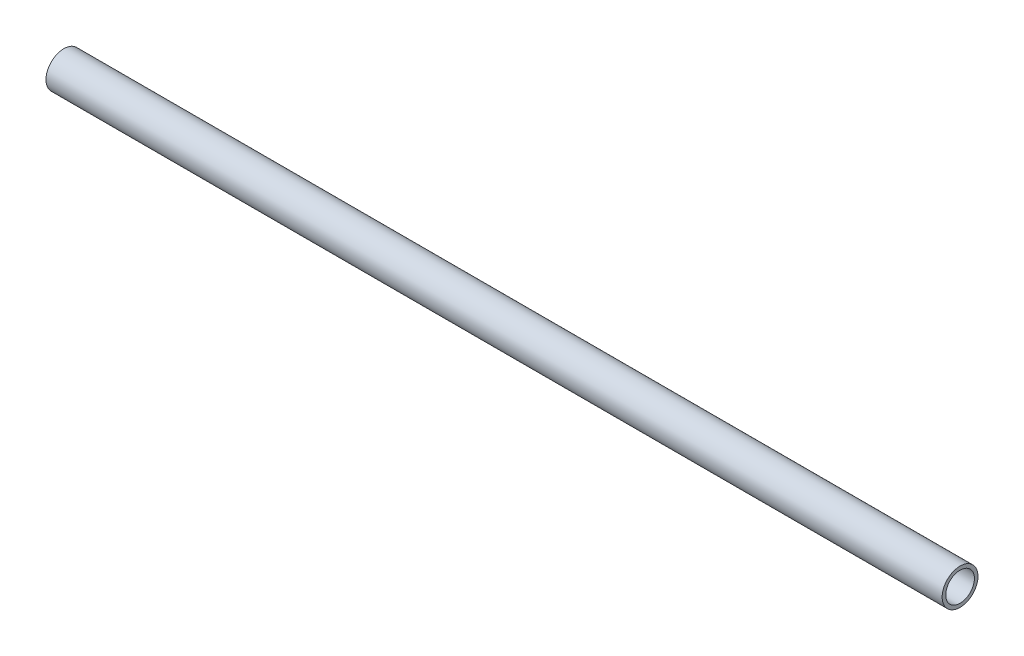
ISO-10303-21;
HEADER;
FILE_DESCRIPTION(('STEP AP214'),'2;1');
FILE_NAME('part.step','',(''),(''),'','','');
FILE_SCHEMA(('AUTOMOTIVE_DESIGN { 1 0 10303 214 1 1 1 1 }'));
ENDSEC;
DATA;
#1=APPLICATION_CONTEXT('core data for automotive mechanical design processes');
#2=APPLICATION_PROTOCOL_DEFINITION('international standard','automotive_design',2000,#1);
#3=PRODUCT_CONTEXT('',#1,'mechanical');
#4=PRODUCT('Part','Part','',(#3));
#5=PRODUCT_RELATED_PRODUCT_CATEGORY('part','',(#4));
#6=PRODUCT_DEFINITION_FORMATION('','',#4);
#7=PRODUCT_DEFINITION_CONTEXT('part definition',#1,'design');
#8=PRODUCT_DEFINITION('design','',#6,#7);
#9=PRODUCT_DEFINITION_SHAPE('','',#8);
#10=(LENGTH_UNIT() NAMED_UNIT(*) SI_UNIT(.MILLI.,.METRE.));
#11=(NAMED_UNIT(*) PLANE_ANGLE_UNIT() SI_UNIT($,.RADIAN.));
#12=(NAMED_UNIT(*) SI_UNIT($,.STERADIAN.) SOLID_ANGLE_UNIT());
#13=UNCERTAINTY_MEASURE_WITH_UNIT(LENGTH_MEASURE(1.E-05),#10,'distance_accuracy_value','');
#14=(GEOMETRIC_REPRESENTATION_CONTEXT(3) GLOBAL_UNCERTAINTY_ASSIGNED_CONTEXT((#13)) GLOBAL_UNIT_ASSIGNED_CONTEXT((#10,
#11,#12)) REPRESENTATION_CONTEXT('',''));
#15=CARTESIAN_POINT('',(0.,0.,0.));
#16=DIRECTION('',(0.,0.,1.));
#17=DIRECTION('',(1.,0.,0.));
#18=AXIS2_PLACEMENT_3D('',#15,#16,#17);
#19=CARTESIAN_POINT('',(250.,0.,0.));
#20=DIRECTION('',(1.,0.,0.));
#21=DIRECTION('',(0.,0.,-1.));
#22=AXIS2_PLACEMENT_3D('',#19,#20,#21);
#23=PLANE('',#22);
#24=CARTESIAN_POINT('',(250.,0.,0.));
#25=DIRECTION('',(1.,0.,0.));
#26=DIRECTION('',(0.,0.,-1.));
#27=AXIS2_PLACEMENT_3D('',#24,#25,#26);
#28=CIRCLE('',#27,5.);
#29=CARTESIAN_POINT('',(250.,0.,-5.));
#30=VERTEX_POINT('',#29);
#31=EDGE_CURVE('E10',#30,#30,#28,.T.);
#32=ORIENTED_EDGE('',*,*,#31,.T.);
#33=EDGE_LOOP('',(#32));
#34=FACE_BOUND('',#33,.T.);
#35=CARTESIAN_POINT('',(250.,0.,0.));
#36=DIRECTION('',(1.,0.,0.));
#37=DIRECTION('',(0.,0.,-1.));
#38=AXIS2_PLACEMENT_3D('',#35,#36,#37);
#39=CIRCLE('',#38,4.);
#40=CARTESIAN_POINT('',(250.,0.,-4.));
#41=VERTEX_POINT('',#40);
#42=EDGE_CURVE('E42',#41,#41,#39,.T.);
#43=ORIENTED_EDGE('',*,*,#42,.F.);
#44=EDGE_LOOP('',(#43));
#45=FACE_BOUND('',#44,.T.);
#46=ADVANCED_FACE('F31',(#34,#45),#23,.T.);
#47=CARTESIAN_POINT('',(0.,0.,0.));
#48=DIRECTION('',(1.,0.,0.));
#49=DIRECTION('',(0.,0.,-1.));
#50=AXIS2_PLACEMENT_3D('',#47,#48,#49);
#51=PLANE('',#50);
#52=CARTESIAN_POINT('',(0.,0.,0.));
#53=DIRECTION('',(1.,0.,0.));
#54=DIRECTION('',(0.,0.,-1.));
#55=AXIS2_PLACEMENT_3D('',#52,#53,#54);
#56=CIRCLE('',#55,5.);
#57=CARTESIAN_POINT('',(0.,0.,-5.));
#58=VERTEX_POINT('',#57);
#59=EDGE_CURVE('E35',#58,#58,#56,.T.);
#60=ORIENTED_EDGE('',*,*,#59,.F.);
#61=EDGE_LOOP('',(#60));
#62=FACE_BOUND('',#61,.T.);
#63=CARTESIAN_POINT('',(0.,0.,0.));
#64=DIRECTION('',(1.,0.,0.));
#65=DIRECTION('',(0.,0.,-1.));
#66=AXIS2_PLACEMENT_3D('',#63,#64,#65);
#67=CIRCLE('',#66,4.);
#68=CARTESIAN_POINT('',(0.,0.,-4.));
#69=VERTEX_POINT('',#68);
#70=EDGE_CURVE('E44',#69,#69,#67,.T.);
#71=ORIENTED_EDGE('',*,*,#70,.T.);
#72=EDGE_LOOP('',(#71));
#73=FACE_BOUND('',#72,.T.);
#74=ADVANCED_FACE('F54',(#62,#73),#51,.F.);
#75=CARTESIAN_POINT('',(250.,0.,0.));
#76=DIRECTION('',(-1.,0.,0.));
#77=DIRECTION('',(0.,0.,1.));
#78=AXIS2_PLACEMENT_3D('',#75,#76,#77);
#79=CYLINDRICAL_SURFACE('',#78,5.);
#80=ORIENTED_EDGE('',*,*,#31,.F.);
#81=EDGE_LOOP('',(#80));
#82=FACE_BOUND('',#81,.T.);
#83=ORIENTED_EDGE('',*,*,#59,.T.);
#84=EDGE_LOOP('',(#83));
#85=FACE_BOUND('',#84,.T.);
#86=ADVANCED_FACE('F33',(#82,#85),#79,.T.);
#87=CARTESIAN_POINT('',(250.,0.,0.));
#88=DIRECTION('',(-1.,0.,0.));
#89=DIRECTION('',(0.,0.,1.));
#90=AXIS2_PLACEMENT_3D('',#87,#88,#89);
#91=CYLINDRICAL_SURFACE('',#90,4.);
#92=ORIENTED_EDGE('',*,*,#42,.T.);
#93=EDGE_LOOP('',(#92));
#94=FACE_BOUND('',#93,.T.);
#95=ORIENTED_EDGE('',*,*,#70,.F.);
#96=EDGE_LOOP('',(#95));
#97=FACE_BOUND('',#96,.T.);
#98=ADVANCED_FACE('F50',(#94,#97),#91,.F.);
#99=CLOSED_SHELL('',(#46,#74,#86,#98));
#100=MANIFOLD_SOLID_BREP('B2',#99);
#101=ADVANCED_BREP_SHAPE_REPRESENTATION('',(#18,#100),#14);
#102=SHAPE_DEFINITION_REPRESENTATION(#9,#101);
ENDSEC;
END-ISO-10303-21;
